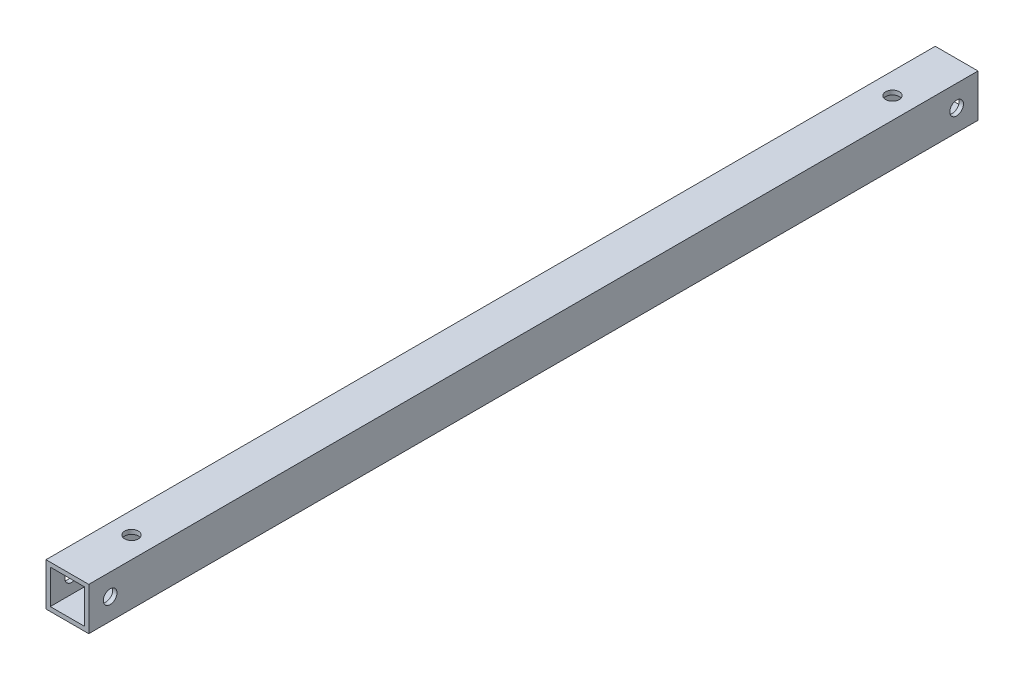
ISO-10303-21;
HEADER;
FILE_DESCRIPTION(('STEP AP214'),'2;1');
FILE_NAME('part.step','',(''),(''),'','','');
FILE_SCHEMA(('AUTOMOTIVE_DESIGN { 1 0 10303 214 1 1 1 1 }'));
ENDSEC;
DATA;
#1=APPLICATION_CONTEXT('core data for automotive mechanical design processes');
#2=APPLICATION_PROTOCOL_DEFINITION('international standard','automotive_design',2000,#1);
#3=PRODUCT_CONTEXT('',#1,'mechanical');
#4=PRODUCT('Part','Part','',(#3));
#5=PRODUCT_RELATED_PRODUCT_CATEGORY('part','',(#4));
#6=PRODUCT_DEFINITION_FORMATION('','',#4);
#7=PRODUCT_DEFINITION_CONTEXT('part definition',#1,'design');
#8=PRODUCT_DEFINITION('design','',#6,#7);
#9=PRODUCT_DEFINITION_SHAPE('','',#8);
#10=(LENGTH_UNIT() NAMED_UNIT(*) SI_UNIT(.MILLI.,.METRE.));
#11=(NAMED_UNIT(*) PLANE_ANGLE_UNIT() SI_UNIT($,.RADIAN.));
#12=(NAMED_UNIT(*) SI_UNIT($,.STERADIAN.) SOLID_ANGLE_UNIT());
#13=UNCERTAINTY_MEASURE_WITH_UNIT(LENGTH_MEASURE(1.E-05),#10,'distance_accuracy_value','');
#14=(GEOMETRIC_REPRESENTATION_CONTEXT(3) GLOBAL_UNCERTAINTY_ASSIGNED_CONTEXT((#13)) GLOBAL_UNIT_ASSIGNED_CONTEXT((#10,
#11,#12)) REPRESENTATION_CONTEXT('',''));
#15=CARTESIAN_POINT('',(0.,0.,0.));
#16=DIRECTION('',(0.,0.,1.));
#17=DIRECTION('',(1.,0.,0.));
#18=AXIS2_PLACEMENT_3D('',#15,#16,#17);
#19=CARTESIAN_POINT('',(0.,0.,208.));
#20=DIRECTION('',(0.,0.,1.));
#21=DIRECTION('',(1.,0.,0.));
#22=AXIS2_PLACEMENT_3D('',#19,#20,#21);
#23=PLANE('',#22);
#24=DIRECTION('',(0.,1.,0.));
#25=VECTOR('',#24,1.);
#26=CARTESIAN_POINT('',(5.,5.,208.));
#27=LINE('',#26,#25);
#28=CARTESIAN_POINT('',(5.,-5.,208.));
#29=VERTEX_POINT('',#28);
#30=CARTESIAN_POINT('',(5.,5.,208.));
#31=VERTEX_POINT('',#30);
#32=EDGE_CURVE('E140',#29,#31,#27,.T.);
#33=ORIENTED_EDGE('',*,*,#32,.T.);
#34=DIRECTION('',(-1.,0.,0.));
#35=VECTOR('',#34,1.);
#36=CARTESIAN_POINT('',(-5.,5.,208.));
#37=LINE('',#36,#35);
#38=CARTESIAN_POINT('',(-5.,5.,208.));
#39=VERTEX_POINT('',#38);
#40=EDGE_CURVE('E143',#31,#39,#37,.T.);
#41=ORIENTED_EDGE('',*,*,#40,.T.);
#42=DIRECTION('',(0.,-1.,0.));
#43=VECTOR('',#42,1.);
#44=CARTESIAN_POINT('',(-5.,5.,208.));
#45=LINE('',#44,#43);
#46=CARTESIAN_POINT('',(-5.,-5.,208.));
#47=VERTEX_POINT('',#46);
#48=EDGE_CURVE('E146',#39,#47,#45,.T.);
#49=ORIENTED_EDGE('',*,*,#48,.T.);
#50=DIRECTION('',(1.,0.,0.));
#51=VECTOR('',#50,1.);
#52=CARTESIAN_POINT('',(-5.,-5.,208.));
#53=LINE('',#52,#51);
#54=EDGE_CURVE('E148',#47,#29,#53,.T.);
#55=ORIENTED_EDGE('',*,*,#54,.T.);
#56=EDGE_LOOP('',(#33,#41,#49,#55));
#57=FACE_BOUND('',#56,.T.);
#58=DIRECTION('',(0.,-1.,0.));
#59=VECTOR('',#58,1.);
#60=CARTESIAN_POINT('',(-4.,4.,208.));
#61=LINE('',#60,#59);
#62=CARTESIAN_POINT('',(-4.,4.,208.));
#63=VERTEX_POINT('',#62);
#64=CARTESIAN_POINT('',(-4.,-4.,208.));
#65=VERTEX_POINT('',#64);
#66=EDGE_CURVE('E110',#63,#65,#61,.T.);
#67=ORIENTED_EDGE('',*,*,#66,.F.);
#68=DIRECTION('',(-1.,0.,0.));
#69=VECTOR('',#68,1.);
#70=CARTESIAN_POINT('',(-4.,4.,208.));
#71=LINE('',#70,#69);
#72=CARTESIAN_POINT('',(4.,4.,208.));
#73=VERTEX_POINT('',#72);
#74=EDGE_CURVE('E102',#73,#63,#71,.T.);
#75=ORIENTED_EDGE('',*,*,#74,.F.);
#76=DIRECTION('',(0.,1.,0.));
#77=VECTOR('',#76,1.);
#78=CARTESIAN_POINT('',(4.,4.,208.));
#79=LINE('',#78,#77);
#80=CARTESIAN_POINT('',(4.,-4.,208.));
#81=VERTEX_POINT('',#80);
#82=EDGE_CURVE('E124',#81,#73,#79,.T.);
#83=ORIENTED_EDGE('',*,*,#82,.F.);
#84=DIRECTION('',(1.,0.,0.));
#85=VECTOR('',#84,1.);
#86=CARTESIAN_POINT('',(-4.,-4.,208.));
#87=LINE('',#86,#85);
#88=EDGE_CURVE('E122',#65,#81,#87,.T.);
#89=ORIENTED_EDGE('',*,*,#88,.F.);
#90=EDGE_LOOP('',(#67,#75,#83,#89));
#91=FACE_BOUND('',#90,.T.);
#92=ADVANCED_FACE('F35',(#57,#91),#23,.T.);
#93=CARTESIAN_POINT('',(0.,0.,0.));
#94=DIRECTION('',(0.,0.,1.));
#95=DIRECTION('',(1.,0.,0.));
#96=AXIS2_PLACEMENT_3D('',#93,#94,#95);
#97=PLANE('',#96);
#98=DIRECTION('',(0.,1.,0.));
#99=VECTOR('',#98,1.);
#100=CARTESIAN_POINT('',(5.,5.,0.));
#101=LINE('',#100,#99);
#102=CARTESIAN_POINT('',(5.,-5.,0.));
#103=VERTEX_POINT('',#102);
#104=CARTESIAN_POINT('',(5.,5.,0.));
#105=VERTEX_POINT('',#104);
#106=EDGE_CURVE('E118',#103,#105,#101,.T.);
#107=ORIENTED_EDGE('',*,*,#106,.F.);
#108=DIRECTION('',(1.,0.,0.));
#109=VECTOR('',#108,1.);
#110=CARTESIAN_POINT('',(-5.,-5.,0.));
#111=LINE('',#110,#109);
#112=CARTESIAN_POINT('',(-5.,-5.,0.));
#113=VERTEX_POINT('',#112);
#114=EDGE_CURVE('E144',#113,#103,#111,.T.);
#115=ORIENTED_EDGE('',*,*,#114,.F.);
#116=DIRECTION('',(0.,-1.,0.));
#117=VECTOR('',#116,1.);
#118=CARTESIAN_POINT('',(-5.,5.,0.));
#119=LINE('',#118,#117);
#120=CARTESIAN_POINT('',(-5.,5.,0.));
#121=VERTEX_POINT('',#120);
#122=EDGE_CURVE('E155',#121,#113,#119,.T.);
#123=ORIENTED_EDGE('',*,*,#122,.F.);
#124=DIRECTION('',(-1.,0.,0.));
#125=VECTOR('',#124,1.);
#126=CARTESIAN_POINT('',(-5.,5.,0.));
#127=LINE('',#126,#125);
#128=EDGE_CURVE('E153',#105,#121,#127,.T.);
#129=ORIENTED_EDGE('',*,*,#128,.F.);
#130=EDGE_LOOP('',(#107,#115,#123,#129));
#131=FACE_BOUND('',#130,.T.);
#132=DIRECTION('',(-1.,0.,0.));
#133=VECTOR('',#132,1.);
#134=CARTESIAN_POINT('',(-4.,4.,0.));
#135=LINE('',#134,#133);
#136=CARTESIAN_POINT('',(4.,4.,0.));
#137=VERTEX_POINT('',#136);
#138=CARTESIAN_POINT('',(-4.,4.,0.));
#139=VERTEX_POINT('',#138);
#140=EDGE_CURVE('E60',#137,#139,#135,.T.);
#141=ORIENTED_EDGE('',*,*,#140,.T.);
#142=DIRECTION('',(0.,-1.,0.));
#143=VECTOR('',#142,1.);
#144=CARTESIAN_POINT('',(-4.,4.,0.));
#145=LINE('',#144,#143);
#146=CARTESIAN_POINT('',(-4.,-4.,0.));
#147=VERTEX_POINT('',#146);
#148=EDGE_CURVE('E117',#139,#147,#145,.T.);
#149=ORIENTED_EDGE('',*,*,#148,.T.);
#150=DIRECTION('',(1.,0.,0.));
#151=VECTOR('',#150,1.);
#152=CARTESIAN_POINT('',(-4.,-4.,0.));
#153=LINE('',#152,#151);
#154=CARTESIAN_POINT('',(4.,-4.,0.));
#155=VERTEX_POINT('',#154);
#156=EDGE_CURVE('E132',#147,#155,#153,.T.);
#157=ORIENTED_EDGE('',*,*,#156,.T.);
#158=DIRECTION('',(0.,1.,0.));
#159=VECTOR('',#158,1.);
#160=CARTESIAN_POINT('',(4.,4.,0.));
#161=LINE('',#160,#159);
#162=EDGE_CURVE('E111',#155,#137,#161,.T.);
#163=ORIENTED_EDGE('',*,*,#162,.T.);
#164=EDGE_LOOP('',(#141,#149,#157,#163));
#165=FACE_BOUND('',#164,.T.);
#166=ADVANCED_FACE('F243',(#131,#165),#97,.F.);
#167=CARTESIAN_POINT('',(5.,5.,208.));
#168=DIRECTION('',(-1.,0.,0.));
#169=DIRECTION('',(0.,-1.,0.));
#170=AXIS2_PLACEMENT_3D('',#167,#168,#169);
#171=PLANE('',#170);
#172=CARTESIAN_POINT('',(5.,0.,203.));
#173=DIRECTION('',(-1.,0.,0.));
#174=DIRECTION('',(0.,-1.,0.));
#175=AXIS2_PLACEMENT_3D('',#172,#173,#174);
#176=CIRCLE('',#175,1.59999999999999);
#177=CARTESIAN_POINT('',(5.,-1.59999999999999,203.));
#178=VERTEX_POINT('',#177);
#179=EDGE_CURVE('E175',#178,#178,#176,.T.);
#180=ORIENTED_EDGE('',*,*,#179,.T.);
#181=EDGE_LOOP('',(#180));
#182=FACE_BOUND('',#181,.T.);
#183=CARTESIAN_POINT('',(5.,0.,5.));
#184=DIRECTION('',(-1.,0.,0.));
#185=DIRECTION('',(0.,-1.,0.));
#186=AXIS2_PLACEMENT_3D('',#183,#184,#185);
#187=CIRCLE('',#186,1.59999999999999);
#188=CARTESIAN_POINT('',(5.,-1.59999999999999,5.));
#189=VERTEX_POINT('',#188);
#190=EDGE_CURVE('E186',#189,#189,#187,.T.);
#191=ORIENTED_EDGE('',*,*,#190,.T.);
#192=EDGE_LOOP('',(#191));
#193=FACE_BOUND('',#192,.T.);
#194=ORIENTED_EDGE('',*,*,#106,.T.);
#195=DIRECTION('',(0.,0.,-1.));
#196=VECTOR('',#195,1.);
#197=CARTESIAN_POINT('',(5.,5.,208.));
#198=LINE('',#197,#196);
#199=EDGE_CURVE('E11',#31,#105,#198,.T.);
#200=ORIENTED_EDGE('',*,*,#199,.F.);
#201=ORIENTED_EDGE('',*,*,#32,.F.);
#202=DIRECTION('',(0.,0.,-1.));
#203=VECTOR('',#202,1.);
#204=CARTESIAN_POINT('',(5.,-5.,208.));
#205=LINE('',#204,#203);
#206=EDGE_CURVE('E150',#29,#103,#205,.T.);
#207=ORIENTED_EDGE('',*,*,#206,.T.);
#208=EDGE_LOOP('',(#194,#200,#201,#207));
#209=FACE_BOUND('',#208,.T.);
#210=ADVANCED_FACE('F37',(#182,#193,#209),#171,.F.);
#211=CARTESIAN_POINT('',(-5.,5.,208.));
#212=DIRECTION('',(0.,-1.,0.));
#213=DIRECTION('',(0.,0.,-1.));
#214=AXIS2_PLACEMENT_3D('',#211,#212,#213);
#215=PLANE('',#214);
#216=CARTESIAN_POINT('',(0.,5.,193.));
#217=DIRECTION('',(0.,1.,0.));
#218=DIRECTION('',(0.,0.,1.));
#219=AXIS2_PLACEMENT_3D('',#216,#217,#218);
#220=CIRCLE('',#219,1.59999999999998);
#221=CARTESIAN_POINT('',(0.,5.,194.6));
#222=VERTEX_POINT('',#221);
#223=EDGE_CURVE('E200',#222,#222,#220,.T.);
#224=ORIENTED_EDGE('',*,*,#223,.F.);
#225=EDGE_LOOP('',(#224));
#226=FACE_BOUND('',#225,.T.);
#227=CARTESIAN_POINT('',(0.,5.,15.));
#228=DIRECTION('',(0.,1.,0.));
#229=DIRECTION('',(0.,0.,1.));
#230=AXIS2_PLACEMENT_3D('',#227,#228,#229);
#231=CIRCLE('',#230,1.6);
#232=CARTESIAN_POINT('',(0.,5.,16.6));
#233=VERTEX_POINT('',#232);
#234=EDGE_CURVE('E197',#233,#233,#231,.T.);
#235=ORIENTED_EDGE('',*,*,#234,.F.);
#236=EDGE_LOOP('',(#235));
#237=FACE_BOUND('',#236,.T.);
#238=ORIENTED_EDGE('',*,*,#128,.T.);
#239=DIRECTION('',(0.,0.,-1.));
#240=VECTOR('',#239,1.);
#241=CARTESIAN_POINT('',(-5.,5.,208.));
#242=LINE('',#241,#240);
#243=EDGE_CURVE('E44',#39,#121,#242,.T.);
#244=ORIENTED_EDGE('',*,*,#243,.F.);
#245=ORIENTED_EDGE('',*,*,#40,.F.);
#246=ORIENTED_EDGE('',*,*,#199,.T.);
#247=EDGE_LOOP('',(#238,#244,#245,#246));
#248=FACE_BOUND('',#247,.T.);
#249=ADVANCED_FACE('F229',(#226,#237,#248),#215,.F.);
#250=CARTESIAN_POINT('',(-5.,5.,208.));
#251=DIRECTION('',(1.,0.,0.));
#252=DIRECTION('',(0.,1.,0.));
#253=AXIS2_PLACEMENT_3D('',#250,#251,#252);
#254=PLANE('',#253);
#255=CARTESIAN_POINT('',(-5.,0.,203.));
#256=DIRECTION('',(-1.,0.,0.));
#257=DIRECTION('',(0.,-1.,0.));
#258=AXIS2_PLACEMENT_3D('',#255,#256,#257);
#259=CIRCLE('',#258,1.59999999999999);
#260=CARTESIAN_POINT('',(-5.,-1.59999999999999,203.));
#261=VERTEX_POINT('',#260);
#262=EDGE_CURVE('E181',#261,#261,#259,.T.);
#263=ORIENTED_EDGE('',*,*,#262,.F.);
#264=EDGE_LOOP('',(#263));
#265=FACE_BOUND('',#264,.T.);
#266=CARTESIAN_POINT('',(-5.,0.,5.));
#267=DIRECTION('',(-1.,0.,0.));
#268=DIRECTION('',(0.,-1.,0.));
#269=AXIS2_PLACEMENT_3D('',#266,#267,#268);
#270=CIRCLE('',#269,1.59999999999999);
#271=CARTESIAN_POINT('',(-5.,-1.59999999999999,5.));
#272=VERTEX_POINT('',#271);
#273=EDGE_CURVE('E191',#272,#272,#270,.T.);
#274=ORIENTED_EDGE('',*,*,#273,.F.);
#275=EDGE_LOOP('',(#274));
#276=FACE_BOUND('',#275,.T.);
#277=ORIENTED_EDGE('',*,*,#122,.T.);
#278=DIRECTION('',(0.,0.,-1.));
#279=VECTOR('',#278,1.);
#280=CARTESIAN_POINT('',(-5.,-5.,208.));
#281=LINE('',#280,#279);
#282=EDGE_CURVE('E160',#47,#113,#281,.T.);
#283=ORIENTED_EDGE('',*,*,#282,.F.);
#284=ORIENTED_EDGE('',*,*,#48,.F.);
#285=ORIENTED_EDGE('',*,*,#243,.T.);
#286=EDGE_LOOP('',(#277,#283,#284,#285));
#287=FACE_BOUND('',#286,.T.);
#288=ADVANCED_FACE('F232',(#265,#276,#287),#254,.F.);
#289=CARTESIAN_POINT('',(-5.,-5.,208.));
#290=DIRECTION('',(0.,1.,0.));
#291=DIRECTION('',(0.,0.,1.));
#292=AXIS2_PLACEMENT_3D('',#289,#290,#291);
#293=PLANE('',#292);
#294=CARTESIAN_POINT('',(0.,-5.,193.));
#295=DIRECTION('',(0.,1.,0.));
#296=DIRECTION('',(0.,0.,1.));
#297=AXIS2_PLACEMENT_3D('',#294,#295,#296);
#298=CIRCLE('',#297,1.59999999999998);
#299=CARTESIAN_POINT('',(0.,-5.,194.6));
#300=VERTEX_POINT('',#299);
#301=EDGE_CURVE('E169',#300,#300,#298,.T.);
#302=ORIENTED_EDGE('',*,*,#301,.T.);
#303=EDGE_LOOP('',(#302));
#304=FACE_BOUND('',#303,.T.);
#305=CARTESIAN_POINT('',(0.,-5.,15.));
#306=DIRECTION('',(0.,1.,0.));
#307=DIRECTION('',(0.,0.,1.));
#308=AXIS2_PLACEMENT_3D('',#305,#306,#307);
#309=CIRCLE('',#308,1.6);
#310=CARTESIAN_POINT('',(0.,-5.,16.6));
#311=VERTEX_POINT('',#310);
#312=EDGE_CURVE('E203',#311,#311,#309,.T.);
#313=ORIENTED_EDGE('',*,*,#312,.T.);
#314=EDGE_LOOP('',(#313));
#315=FACE_BOUND('',#314,.T.);
#316=ORIENTED_EDGE('',*,*,#114,.T.);
#317=ORIENTED_EDGE('',*,*,#206,.F.);
#318=ORIENTED_EDGE('',*,*,#54,.F.);
#319=ORIENTED_EDGE('',*,*,#282,.T.);
#320=EDGE_LOOP('',(#316,#317,#318,#319));
#321=FACE_BOUND('',#320,.T.);
#322=ADVANCED_FACE('F217',(#304,#315,#321),#293,.F.);
#323=CARTESIAN_POINT('',(-4.,4.,208.));
#324=DIRECTION('',(0.,-1.,0.));
#325=DIRECTION('',(0.,0.,-1.));
#326=AXIS2_PLACEMENT_3D('',#323,#324,#325);
#327=PLANE('',#326);
#328=CARTESIAN_POINT('',(0.,4.,193.));
#329=DIRECTION('',(0.,-1.,0.));
#330=DIRECTION('',(0.,0.,-1.));
#331=AXIS2_PLACEMENT_3D('',#328,#329,#330);
#332=CIRCLE('',#331,1.59999999999998);
#333=CARTESIAN_POINT('',(0.,4.,191.4));
#334=VERTEX_POINT('',#333);
#335=EDGE_CURVE('E130',#334,#334,#332,.T.);
#336=ORIENTED_EDGE('',*,*,#335,.F.);
#337=EDGE_LOOP('',(#336));
#338=FACE_BOUND('',#337,.T.);
#339=CARTESIAN_POINT('',(0.,4.,15.));
#340=DIRECTION('',(0.,-1.,0.));
#341=DIRECTION('',(0.,0.,-1.));
#342=AXIS2_PLACEMENT_3D('',#339,#340,#341);
#343=CIRCLE('',#342,1.6);
#344=CARTESIAN_POINT('',(0.,4.,13.4));
#345=VERTEX_POINT('',#344);
#346=EDGE_CURVE('E168',#345,#345,#343,.T.);
#347=ORIENTED_EDGE('',*,*,#346,.F.);
#348=EDGE_LOOP('',(#347));
#349=FACE_BOUND('',#348,.T.);
#350=ORIENTED_EDGE('',*,*,#140,.F.);
#351=DIRECTION('',(0.,0.,-1.));
#352=VECTOR('',#351,1.);
#353=CARTESIAN_POINT('',(4.,4.,208.));
#354=LINE('',#353,#352);
#355=EDGE_CURVE('E106',#73,#137,#354,.T.);
#356=ORIENTED_EDGE('',*,*,#355,.F.);
#357=ORIENTED_EDGE('',*,*,#74,.T.);
#358=DIRECTION('',(0.,0.,-1.));
#359=VECTOR('',#358,1.);
#360=CARTESIAN_POINT('',(-4.,4.,208.));
#361=LINE('',#360,#359);
#362=EDGE_CURVE('E105',#63,#139,#361,.T.);
#363=ORIENTED_EDGE('',*,*,#362,.T.);
#364=EDGE_LOOP('',(#350,#356,#357,#363));
#365=FACE_BOUND('',#364,.T.);
#366=ADVANCED_FACE('F104',(#338,#349,#365),#327,.T.);
#367=CARTESIAN_POINT('',(-4.,4.,208.));
#368=DIRECTION('',(1.,0.,0.));
#369=DIRECTION('',(0.,1.,0.));
#370=AXIS2_PLACEMENT_3D('',#367,#368,#369);
#371=PLANE('',#370);
#372=CARTESIAN_POINT('',(-4.,0.,203.));
#373=DIRECTION('',(1.,0.,0.));
#374=DIRECTION('',(0.,1.,0.));
#375=AXIS2_PLACEMENT_3D('',#372,#373,#374);
#376=CIRCLE('',#375,1.59999999999999);
#377=CARTESIAN_POINT('',(-4.,1.59999999999999,203.));
#378=VERTEX_POINT('',#377);
#379=EDGE_CURVE('E194',#378,#378,#376,.T.);
#380=ORIENTED_EDGE('',*,*,#379,.F.);
#381=EDGE_LOOP('',(#380));
#382=FACE_BOUND('',#381,.T.);
#383=CARTESIAN_POINT('',(-4.,0.,5.));
#384=DIRECTION('',(1.,0.,0.));
#385=DIRECTION('',(0.,1.,0.));
#386=AXIS2_PLACEMENT_3D('',#383,#384,#385);
#387=CIRCLE('',#386,1.59999999999999);
#388=CARTESIAN_POINT('',(-4.,1.59999999999999,5.));
#389=VERTEX_POINT('',#388);
#390=EDGE_CURVE('E174',#389,#389,#387,.T.);
#391=ORIENTED_EDGE('',*,*,#390,.F.);
#392=EDGE_LOOP('',(#391));
#393=FACE_BOUND('',#392,.T.);
#394=ORIENTED_EDGE('',*,*,#148,.F.);
#395=ORIENTED_EDGE('',*,*,#362,.F.);
#396=ORIENTED_EDGE('',*,*,#66,.T.);
#397=DIRECTION('',(0.,0.,-1.));
#398=VECTOR('',#397,1.);
#399=CARTESIAN_POINT('',(-4.,-4.,208.));
#400=LINE('',#399,#398);
#401=EDGE_CURVE('E119',#65,#147,#400,.T.);
#402=ORIENTED_EDGE('',*,*,#401,.T.);
#403=EDGE_LOOP('',(#394,#395,#396,#402));
#404=FACE_BOUND('',#403,.T.);
#405=ADVANCED_FACE('F114',(#382,#393,#404),#371,.T.);
#406=CARTESIAN_POINT('',(-4.,-4.,208.));
#407=DIRECTION('',(0.,1.,0.));
#408=DIRECTION('',(-1.,0.,0.));
#409=AXIS2_PLACEMENT_3D('',#406,#407,#408);
#410=PLANE('',#409);
#411=CARTESIAN_POINT('',(0.,-4.,193.));
#412=DIRECTION('',(0.,1.,0.));
#413=DIRECTION('',(-1.,0.,0.));
#414=AXIS2_PLACEMENT_3D('',#411,#412,#413);
#415=CIRCLE('',#414,1.59999999999998);
#416=CARTESIAN_POINT('',(-1.59999999999998,-4.,193.));
#417=VERTEX_POINT('',#416);
#418=EDGE_CURVE('E170',#417,#417,#415,.T.);
#419=ORIENTED_EDGE('',*,*,#418,.F.);
#420=EDGE_LOOP('',(#419));
#421=FACE_BOUND('',#420,.T.);
#422=CARTESIAN_POINT('',(0.,-4.,15.));
#423=DIRECTION('',(0.,1.,0.));
#424=DIRECTION('',(-1.,0.,0.));
#425=AXIS2_PLACEMENT_3D('',#422,#423,#424);
#426=CIRCLE('',#425,1.6);
#427=CARTESIAN_POINT('',(-1.6,-4.,15.));
#428=VERTEX_POINT('',#427);
#429=EDGE_CURVE('E165',#428,#428,#426,.T.);
#430=ORIENTED_EDGE('',*,*,#429,.F.);
#431=EDGE_LOOP('',(#430));
#432=FACE_BOUND('',#431,.T.);
#433=ORIENTED_EDGE('',*,*,#156,.F.);
#434=ORIENTED_EDGE('',*,*,#401,.F.);
#435=ORIENTED_EDGE('',*,*,#88,.T.);
#436=DIRECTION('',(0.,0.,-1.));
#437=VECTOR('',#436,1.);
#438=CARTESIAN_POINT('',(4.,-4.,208.));
#439=LINE('',#438,#437);
#440=EDGE_CURVE('E52',#81,#155,#439,.T.);
#441=ORIENTED_EDGE('',*,*,#440,.T.);
#442=EDGE_LOOP('',(#433,#434,#435,#441));
#443=FACE_BOUND('',#442,.T.);
#444=ADVANCED_FACE('F324',(#421,#432,#443),#410,.T.);
#445=CARTESIAN_POINT('',(4.,4.,208.));
#446=DIRECTION('',(-1.,0.,0.));
#447=DIRECTION('',(0.,-1.,0.));
#448=AXIS2_PLACEMENT_3D('',#445,#446,#447);
#449=PLANE('',#448);
#450=CARTESIAN_POINT('',(4.,0.,203.));
#451=DIRECTION('',(-1.,0.,0.));
#452=DIRECTION('',(0.,-1.,0.));
#453=AXIS2_PLACEMENT_3D('',#450,#451,#452);
#454=CIRCLE('',#453,1.59999999999999);
#455=CARTESIAN_POINT('',(4.,-1.59999999999999,203.));
#456=VERTEX_POINT('',#455);
#457=EDGE_CURVE('E39',#456,#456,#454,.T.);
#458=ORIENTED_EDGE('',*,*,#457,.F.);
#459=EDGE_LOOP('',(#458));
#460=FACE_BOUND('',#459,.T.);
#461=CARTESIAN_POINT('',(4.,0.,5.));
#462=DIRECTION('',(-1.,0.,0.));
#463=DIRECTION('',(0.,-1.,0.));
#464=AXIS2_PLACEMENT_3D('',#461,#462,#463);
#465=CIRCLE('',#464,1.59999999999999);
#466=CARTESIAN_POINT('',(4.,-1.59999999999999,5.));
#467=VERTEX_POINT('',#466);
#468=EDGE_CURVE('E172',#467,#467,#465,.T.);
#469=ORIENTED_EDGE('',*,*,#468,.F.);
#470=EDGE_LOOP('',(#469));
#471=FACE_BOUND('',#470,.T.);
#472=ORIENTED_EDGE('',*,*,#162,.F.);
#473=ORIENTED_EDGE('',*,*,#440,.F.);
#474=ORIENTED_EDGE('',*,*,#82,.T.);
#475=ORIENTED_EDGE('',*,*,#355,.T.);
#476=EDGE_LOOP('',(#472,#473,#474,#475));
#477=FACE_BOUND('',#476,.T.);
#478=ADVANCED_FACE('F329',(#460,#471,#477),#449,.T.);
#479=CARTESIAN_POINT('',(0.,-5.,15.));
#480=DIRECTION('',(0.,1.,0.));
#481=DIRECTION('',(0.,0.,1.));
#482=AXIS2_PLACEMENT_3D('',#479,#480,#481);
#483=CYLINDRICAL_SURFACE('',#482,1.6);
#484=ORIENTED_EDGE('',*,*,#429,.T.);
#485=EDGE_LOOP('',(#484));
#486=FACE_BOUND('',#485,.T.);
#487=ORIENTED_EDGE('',*,*,#312,.F.);
#488=EDGE_LOOP('',(#487));
#489=FACE_BOUND('',#488,.T.);
#490=ADVANCED_FACE('F226',(#486,#489),#483,.F.);
#491=CARTESIAN_POINT('',(0.,-5.,193.));
#492=DIRECTION('',(0.,1.,0.));
#493=DIRECTION('',(0.,0.,1.));
#494=AXIS2_PLACEMENT_3D('',#491,#492,#493);
#495=CYLINDRICAL_SURFACE('',#494,1.59999999999998);
#496=ORIENTED_EDGE('',*,*,#418,.T.);
#497=EDGE_LOOP('',(#496));
#498=FACE_BOUND('',#497,.T.);
#499=ORIENTED_EDGE('',*,*,#301,.F.);
#500=EDGE_LOOP('',(#499));
#501=FACE_BOUND('',#500,.T.);
#502=ADVANCED_FACE('F224',(#498,#501),#495,.F.);
#503=ORIENTED_EDGE('',*,*,#346,.T.);
#504=EDGE_LOOP('',(#503));
#505=FACE_BOUND('',#504,.T.);
#506=ORIENTED_EDGE('',*,*,#234,.T.);
#507=EDGE_LOOP('',(#506));
#508=FACE_BOUND('',#507,.T.);
#509=ADVANCED_FACE('F221',(#505,#508),#483,.F.);
#510=ORIENTED_EDGE('',*,*,#335,.T.);
#511=EDGE_LOOP('',(#510));
#512=FACE_BOUND('',#511,.T.);
#513=ORIENTED_EDGE('',*,*,#223,.T.);
#514=EDGE_LOOP('',(#513));
#515=FACE_BOUND('',#514,.T.);
#516=ADVANCED_FACE('F212',(#512,#515),#495,.F.);
#517=CARTESIAN_POINT('',(5.,0.,5.));
#518=DIRECTION('',(-1.,0.,0.));
#519=DIRECTION('',(0.,-1.,0.));
#520=AXIS2_PLACEMENT_3D('',#517,#518,#519);
#521=CYLINDRICAL_SURFACE('',#520,1.59999999999999);
#522=ORIENTED_EDGE('',*,*,#468,.T.);
#523=EDGE_LOOP('',(#522));
#524=FACE_BOUND('',#523,.T.);
#525=ORIENTED_EDGE('',*,*,#190,.F.);
#526=EDGE_LOOP('',(#525));
#527=FACE_BOUND('',#526,.T.);
#528=ADVANCED_FACE('F276',(#524,#527),#521,.F.);
#529=CARTESIAN_POINT('',(5.,0.,203.));
#530=DIRECTION('',(-1.,0.,0.));
#531=DIRECTION('',(0.,-1.,0.));
#532=AXIS2_PLACEMENT_3D('',#529,#530,#531);
#533=CYLINDRICAL_SURFACE('',#532,1.59999999999999);
#534=ORIENTED_EDGE('',*,*,#457,.T.);
#535=EDGE_LOOP('',(#534));
#536=FACE_BOUND('',#535,.T.);
#537=ORIENTED_EDGE('',*,*,#179,.F.);
#538=EDGE_LOOP('',(#537));
#539=FACE_BOUND('',#538,.T.);
#540=ADVANCED_FACE('F273',(#536,#539),#533,.F.);
#541=ORIENTED_EDGE('',*,*,#390,.T.);
#542=EDGE_LOOP('',(#541));
#543=FACE_BOUND('',#542,.T.);
#544=ORIENTED_EDGE('',*,*,#273,.T.);
#545=EDGE_LOOP('',(#544));
#546=FACE_BOUND('',#545,.T.);
#547=ADVANCED_FACE('F270',(#543,#546),#521,.F.);
#548=ORIENTED_EDGE('',*,*,#379,.T.);
#549=EDGE_LOOP('',(#548));
#550=FACE_BOUND('',#549,.T.);
#551=ORIENTED_EDGE('',*,*,#262,.T.);
#552=EDGE_LOOP('',(#551));
#553=FACE_BOUND('',#552,.T.);
#554=ADVANCED_FACE('F272',(#550,#553),#533,.F.);
#555=CLOSED_SHELL('',(#92,#166,#210,#249,#288,#322,#366,#405,#444,#478,#490,#502,#509,#516,#528,
#540,#547,#554));
#556=MANIFOLD_SOLID_BREP('B2',#555);
#557=ADVANCED_BREP_SHAPE_REPRESENTATION('',(#18,#556),#14);
#558=SHAPE_DEFINITION_REPRESENTATION(#9,#557);
ENDSEC;
END-ISO-10303-21;
